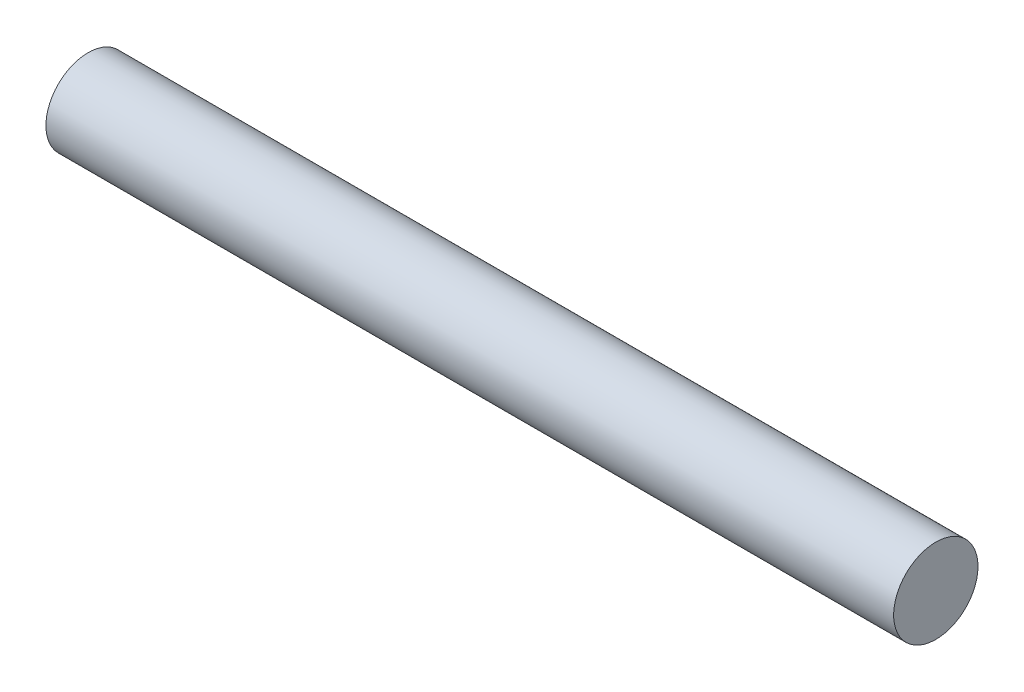
ISO-10303-21;
HEADER;
FILE_DESCRIPTION(('STEP AP214'),'2;1');
FILE_NAME('part.step','',(''),(''),'','','');
FILE_SCHEMA(('AUTOMOTIVE_DESIGN { 1 0 10303 214 1 1 1 1 }'));
ENDSEC;
DATA;
#1=APPLICATION_CONTEXT('core data for automotive mechanical design processes');
#2=APPLICATION_PROTOCOL_DEFINITION('international standard','automotive_design',2000,#1);
#3=PRODUCT_CONTEXT('',#1,'mechanical');
#4=PRODUCT('Part','Part','',(#3));
#5=PRODUCT_RELATED_PRODUCT_CATEGORY('part','',(#4));
#6=PRODUCT_DEFINITION_FORMATION('','',#4);
#7=PRODUCT_DEFINITION_CONTEXT('part definition',#1,'design');
#8=PRODUCT_DEFINITION('design','',#6,#7);
#9=PRODUCT_DEFINITION_SHAPE('','',#8);
#10=(LENGTH_UNIT() NAMED_UNIT(*) SI_UNIT(.MILLI.,.METRE.));
#11=(NAMED_UNIT(*) PLANE_ANGLE_UNIT() SI_UNIT($,.RADIAN.));
#12=(NAMED_UNIT(*) SI_UNIT($,.STERADIAN.) SOLID_ANGLE_UNIT());
#13=UNCERTAINTY_MEASURE_WITH_UNIT(LENGTH_MEASURE(1.E-05),#10,'distance_accuracy_value','');
#14=(GEOMETRIC_REPRESENTATION_CONTEXT(3) GLOBAL_UNCERTAINTY_ASSIGNED_CONTEXT((#13)) GLOBAL_UNIT_ASSIGNED_CONTEXT((#10,
#11,#12)) REPRESENTATION_CONTEXT('',''));
#15=CARTESIAN_POINT('',(0.,0.,0.));
#16=DIRECTION('',(0.,0.,1.));
#17=DIRECTION('',(1.,0.,0.));
#18=AXIS2_PLACEMENT_3D('',#15,#16,#17);
#19=CARTESIAN_POINT('',(60.29999878,0.,0.));
#20=DIRECTION('',(-1.,0.,0.));
#21=DIRECTION('',(0.,0.,1.));
#22=AXIS2_PLACEMENT_3D('',#19,#20,#21);
#23=CYLINDRICAL_SURFACE('',#22,3.);
#24=CARTESIAN_POINT('',(60.29999878,0.,0.));
#25=DIRECTION('',(1.,0.,0.));
#26=DIRECTION('',(0.,0.,-1.));
#27=AXIS2_PLACEMENT_3D('',#24,#25,#26);
#28=CIRCLE('',#27,3.);
#29=CARTESIAN_POINT('',(60.29999878,0.,-3.));
#30=VERTEX_POINT('',#29);
#31=EDGE_CURVE('E10',#30,#30,#28,.T.);
#32=ORIENTED_EDGE('',*,*,#31,.F.);
#33=EDGE_LOOP('',(#32));
#34=FACE_BOUND('',#33,.T.);
#35=CARTESIAN_POINT('',(0.,0.,0.));
#36=DIRECTION('',(1.,0.,0.));
#37=DIRECTION('',(0.,0.,-1.));
#38=AXIS2_PLACEMENT_3D('',#35,#36,#37);
#39=CIRCLE('',#38,3.);
#40=CARTESIAN_POINT('',(0.,0.,-3.));
#41=VERTEX_POINT('',#40);
#42=EDGE_CURVE('E46',#41,#41,#39,.T.);
#43=ORIENTED_EDGE('',*,*,#42,.T.);
#44=EDGE_LOOP('',(#43));
#45=FACE_BOUND('',#44,.T.);
#46=ADVANCED_FACE('F43',(#34,#45),#23,.T.);
#47=CARTESIAN_POINT('',(60.29999878,0.,0.));
#48=DIRECTION('',(1.,0.,0.));
#49=DIRECTION('',(0.,0.,-1.));
#50=AXIS2_PLACEMENT_3D('',#47,#48,#49);
#51=PLANE('',#50);
#52=ORIENTED_EDGE('',*,*,#31,.T.);
#53=EDGE_LOOP('',(#52));
#54=FACE_BOUND('',#53,.T.);
#55=ADVANCED_FACE('F58',(#54),#51,.T.);
#56=CARTESIAN_POINT('',(0.,0.,0.));
#57=DIRECTION('',(1.,0.,0.));
#58=DIRECTION('',(0.,0.,-1.));
#59=AXIS2_PLACEMENT_3D('',#56,#57,#58);
#60=PLANE('',#59);
#61=ORIENTED_EDGE('',*,*,#42,.F.);
#62=EDGE_LOOP('',(#61));
#63=FACE_BOUND('',#62,.T.);
#64=ADVANCED_FACE('F59',(#63),#60,.F.);
#65=CLOSED_SHELL('',(#46,#55,#64));
#66=MANIFOLD_SOLID_BREP('B2',#65);
#67=ADVANCED_BREP_SHAPE_REPRESENTATION('',(#18,#66),#14);
#68=SHAPE_DEFINITION_REPRESENTATION(#9,#67);
ENDSEC;
END-ISO-10303-21;
